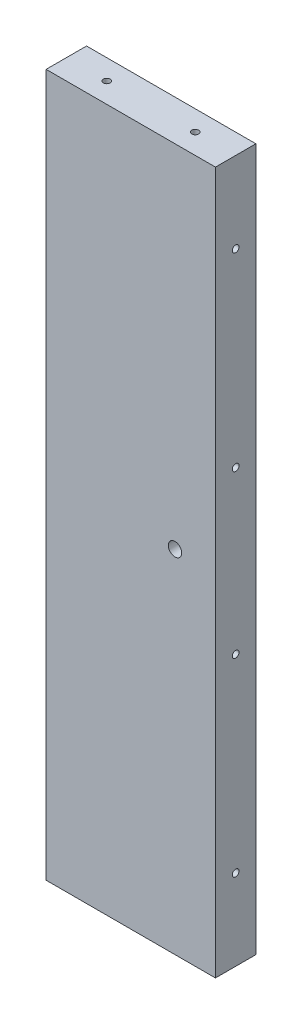
ISO-10303-21;
HEADER;
FILE_DESCRIPTION(('STEP AP214'),'2;1');
FILE_NAME('part.step','',(''),(''),'','','');
FILE_SCHEMA(('AUTOMOTIVE_DESIGN { 1 0 10303 214 1 1 1 1 }'));
ENDSEC;
DATA;
#1=APPLICATION_CONTEXT('core data for automotive mechanical design processes');
#2=APPLICATION_PROTOCOL_DEFINITION('international standard','automotive_design',2000,#1);
#3=PRODUCT_CONTEXT('',#1,'mechanical');
#4=PRODUCT('Part','Part','',(#3));
#5=PRODUCT_RELATED_PRODUCT_CATEGORY('part','',(#4));
#6=PRODUCT_DEFINITION_FORMATION('','',#4);
#7=PRODUCT_DEFINITION_CONTEXT('part definition',#1,'design');
#8=PRODUCT_DEFINITION('design','',#6,#7);
#9=PRODUCT_DEFINITION_SHAPE('','',#8);
#10=(LENGTH_UNIT() NAMED_UNIT(*) SI_UNIT(.MILLI.,.METRE.));
#11=(NAMED_UNIT(*) PLANE_ANGLE_UNIT() SI_UNIT($,.RADIAN.));
#12=(NAMED_UNIT(*) SI_UNIT($,.STERADIAN.) SOLID_ANGLE_UNIT());
#13=UNCERTAINTY_MEASURE_WITH_UNIT(LENGTH_MEASURE(1.E-05),#10,'distance_accuracy_value','');
#14=(GEOMETRIC_REPRESENTATION_CONTEXT(3) GLOBAL_UNCERTAINTY_ASSIGNED_CONTEXT((#13)) GLOBAL_UNIT_ASSIGNED_CONTEXT((#10,
#11,#12)) REPRESENTATION_CONTEXT('',''));
#15=CARTESIAN_POINT('',(0.,0.,0.));
#16=DIRECTION('',(0.,0.,1.));
#17=DIRECTION('',(1.,0.,0.));
#18=AXIS2_PLACEMENT_3D('',#15,#16,#17);
#19=CARTESIAN_POINT('',(209.352967180645,93.4499999969934,19.05));
#20=DIRECTION('',(1.,0.,0.));
#21=DIRECTION('',(0.,1.,0.));
#22=AXIS2_PLACEMENT_3D('',#19,#20,#21);
#23=PLANE('',#22);
#24=DIRECTION('',(0.,-1.,0.));
#25=VECTOR('',#24,1.);
#26=CARTESIAN_POINT('',(209.352967180645,93.4499999969934,0.));
#27=LINE('',#26,#25);
#28=CARTESIAN_POINT('',(209.352967180645,93.4499999969934,0.));
#29=VERTEX_POINT('',#28);
#30=CARTESIAN_POINT('',(209.352967180645,-237.499999991006,0.));
#31=VERTEX_POINT('',#30);
#32=EDGE_CURVE('E141',#29,#31,#27,.T.);
#33=ORIENTED_EDGE('',*,*,#32,.T.);
#34=DIRECTION('',(0.,0.,-1.));
#35=VECTOR('',#34,1.);
#36=CARTESIAN_POINT('',(209.352967180645,-237.499999991006,19.05));
#37=LINE('',#36,#35);
#38=CARTESIAN_POINT('',(209.352967180645,-237.499999991006,19.05));
#39=VERTEX_POINT('',#38);
#40=EDGE_CURVE('E11',#39,#31,#37,.T.);
#41=ORIENTED_EDGE('',*,*,#40,.F.);
#42=DIRECTION('',(0.,-1.,0.));
#43=VECTOR('',#42,1.);
#44=CARTESIAN_POINT('',(209.352967180645,93.4499999969934,19.05));
#45=LINE('',#44,#43);
#46=CARTESIAN_POINT('',(209.352967180645,93.4499999969934,19.05));
#47=VERTEX_POINT('',#46);
#48=EDGE_CURVE('E142',#47,#39,#45,.T.);
#49=ORIENTED_EDGE('',*,*,#48,.F.);
#50=DIRECTION('',(0.,0.,-1.));
#51=VECTOR('',#50,1.);
#52=CARTESIAN_POINT('',(209.352967180645,93.4499999969934,19.05));
#53=LINE('',#52,#51);
#54=EDGE_CURVE('E148',#47,#29,#53,.T.);
#55=ORIENTED_EDGE('',*,*,#54,.T.);
#56=EDGE_LOOP('',(#33,#41,#49,#55));
#57=FACE_BOUND('',#56,.T.);
#58=ADVANCED_FACE('F35',(#57),#23,.F.);
#59=CARTESIAN_POINT('',(209.352967180645,-237.499999991006,19.05));
#60=DIRECTION('',(0.,1.,0.));
#61=DIRECTION('',(0.,0.,1.));
#62=AXIS2_PLACEMENT_3D('',#59,#60,#61);
#63=PLANE('',#62);
#64=DIRECTION('',(1.,0.,0.));
#65=VECTOR('',#64,1.);
#66=CARTESIAN_POINT('',(209.352967180645,-237.499999991006,0.));
#67=LINE('',#66,#65);
#68=CARTESIAN_POINT('',(289.146618108645,-237.499999991006,0.));
#69=VERTEX_POINT('',#68);
#70=EDGE_CURVE('E151',#31,#69,#67,.T.);
#71=ORIENTED_EDGE('',*,*,#70,.T.);
#72=DIRECTION('',(0.,0.,-1.));
#73=VECTOR('',#72,1.);
#74=CARTESIAN_POINT('',(289.146618108645,-237.499999991006,19.05));
#75=LINE('',#74,#73);
#76=CARTESIAN_POINT('',(289.146618108645,-237.499999991006,19.05));
#77=VERTEX_POINT('',#76);
#78=EDGE_CURVE('E44',#77,#69,#75,.T.);
#79=ORIENTED_EDGE('',*,*,#78,.F.);
#80=DIRECTION('',(1.,0.,0.));
#81=VECTOR('',#80,1.);
#82=CARTESIAN_POINT('',(209.352967180645,-237.499999991006,19.05));
#83=LINE('',#82,#81);
#84=EDGE_CURVE('E84',#39,#77,#83,.T.);
#85=ORIENTED_EDGE('',*,*,#84,.F.);
#86=ORIENTED_EDGE('',*,*,#40,.T.);
#87=EDGE_LOOP('',(#71,#79,#85,#86));
#88=FACE_BOUND('',#87,.T.);
#89=ADVANCED_FACE('F188',(#88),#63,.F.);
#90=CARTESIAN_POINT('',(289.146618108645,93.4499999969934,19.05));
#91=DIRECTION('',(-1.,0.,0.));
#92=DIRECTION('',(0.,-1.,0.));
#93=AXIS2_PLACEMENT_3D('',#90,#91,#92);
#94=PLANE('',#93);
#95=CARTESIAN_POINT('',(289.146618108645,55.3499999971998,9.52499989602375));
#96=DIRECTION('',(-1.,0.,0.));
#97=DIRECTION('',(0.,-1.,0.));
#98=AXIS2_PLACEMENT_3D('',#95,#96,#97);
#99=CIRCLE('',#98,1.5875);
#100=CARTESIAN_POINT('',(289.146618108645,53.7624999971998,9.52499989602375));
#101=VERTEX_POINT('',#100);
#102=EDGE_CURVE('E122',#101,#101,#99,.T.);
#103=ORIENTED_EDGE('',*,*,#102,.T.);
#104=EDGE_LOOP('',(#103));
#105=FACE_BOUND('',#104,.T.);
#106=CARTESIAN_POINT('',(289.146618108645,-33.9249999969054,9.52499989602175));
#107=DIRECTION('',(-1.,0.,0.));
#108=DIRECTION('',(0.,-1.,0.));
#109=AXIS2_PLACEMENT_3D('',#106,#107,#108);
#110=CIRCLE('',#109,1.5875);
#111=CARTESIAN_POINT('',(289.146618108645,-35.5124999969054,9.52499989602175));
#112=VERTEX_POINT('',#111);
#113=EDGE_CURVE('E126',#112,#112,#110,.T.);
#114=ORIENTED_EDGE('',*,*,#113,.T.);
#115=EDGE_LOOP('',(#114));
#116=FACE_BOUND('',#115,.T.);
#117=CARTESIAN_POINT('',(289.146618108645,-110.124999996905,9.52499989602175));
#118=DIRECTION('',(-1.,0.,0.));
#119=DIRECTION('',(0.,-1.,0.));
#120=AXIS2_PLACEMENT_3D('',#117,#118,#119);
#121=CIRCLE('',#120,1.58750000000001);
#122=CARTESIAN_POINT('',(289.146618108645,-111.712499996905,9.52499989602175));
#123=VERTEX_POINT('',#122);
#124=EDGE_CURVE('E130',#123,#123,#121,.T.);
#125=ORIENTED_EDGE('',*,*,#124,.T.);
#126=EDGE_LOOP('',(#125));
#127=FACE_BOUND('',#126,.T.);
#128=CARTESIAN_POINT('',(289.146618108645,-199.399999991011,9.52499989602375));
#129=DIRECTION('',(-1.,0.,0.));
#130=DIRECTION('',(0.,-1.,0.));
#131=AXIS2_PLACEMENT_3D('',#128,#129,#130);
#132=CIRCLE('',#131,1.58749999999999);
#133=CARTESIAN_POINT('',(289.146618108645,-200.987499991011,9.52499989602375));
#134=VERTEX_POINT('',#133);
#135=EDGE_CURVE('E134',#134,#134,#132,.T.);
#136=ORIENTED_EDGE('',*,*,#135,.T.);
#137=EDGE_LOOP('',(#136));
#138=FACE_BOUND('',#137,.T.);
#139=DIRECTION('',(0.,1.,0.));
#140=VECTOR('',#139,1.);
#141=CARTESIAN_POINT('',(289.146618108645,93.4499999969934,0.));
#142=LINE('',#141,#140);
#143=CARTESIAN_POINT('',(289.146618108645,93.4499999969934,0.));
#144=VERTEX_POINT('',#143);
#145=EDGE_CURVE('E71',#69,#144,#142,.T.);
#146=ORIENTED_EDGE('',*,*,#145,.T.);
#147=DIRECTION('',(0.,0.,-1.));
#148=VECTOR('',#147,1.);
#149=CARTESIAN_POINT('',(289.146618108645,93.4499999969934,19.05));
#150=LINE('',#149,#148);
#151=CARTESIAN_POINT('',(289.146618108645,93.4499999969934,19.05));
#152=VERTEX_POINT('',#151);
#153=EDGE_CURVE('E156',#152,#144,#150,.T.);
#154=ORIENTED_EDGE('',*,*,#153,.F.);
#155=DIRECTION('',(0.,1.,0.));
#156=VECTOR('',#155,1.);
#157=CARTESIAN_POINT('',(289.146618108645,93.4499999969934,19.05));
#158=LINE('',#157,#156);
#159=EDGE_CURVE('E145',#77,#152,#158,.T.);
#160=ORIENTED_EDGE('',*,*,#159,.F.);
#161=ORIENTED_EDGE('',*,*,#78,.T.);
#162=EDGE_LOOP('',(#146,#154,#160,#161));
#163=FACE_BOUND('',#162,.T.);
#164=ADVANCED_FACE('F193',(#105,#116,#127,#138,#163),#94,.F.);
#165=CARTESIAN_POINT('',(209.352967180645,93.4499999969934,19.05));
#166=DIRECTION('',(0.,-1.,0.));
#167=DIRECTION('',(0.,0.,-1.));
#168=AXIS2_PLACEMENT_3D('',#165,#166,#167);
#169=PLANE('',#168);
#170=CARTESIAN_POINT('',(228.402967180674,93.4499999969934,9.52499999998606));
#171=DIRECTION('',(0.,-1.,0.));
#172=DIRECTION('',(0.,0.,-1.));
#173=AXIS2_PLACEMENT_3D('',#170,#171,#172);
#174=CIRCLE('',#173,1.58749999999999);
#175=CARTESIAN_POINT('',(228.402967180674,93.4499999969934,7.93749999998607));
#176=VERTEX_POINT('',#175);
#177=EDGE_CURVE('E38',#176,#176,#174,.T.);
#178=ORIENTED_EDGE('',*,*,#177,.T.);
#179=EDGE_LOOP('',(#178));
#180=FACE_BOUND('',#179,.T.);
#181=CARTESIAN_POINT('',(270.096618108674,93.4499999969934,9.5249999999854));
#182=DIRECTION('',(0.,-1.,0.));
#183=DIRECTION('',(0.,0.,-1.));
#184=AXIS2_PLACEMENT_3D('',#181,#182,#183);
#185=CIRCLE('',#184,1.58750000000002);
#186=CARTESIAN_POINT('',(270.096618108674,93.4499999969934,7.93749999998538));
#187=VERTEX_POINT('',#186);
#188=EDGE_CURVE('E118',#187,#187,#185,.T.);
#189=ORIENTED_EDGE('',*,*,#188,.T.);
#190=EDGE_LOOP('',(#189));
#191=FACE_BOUND('',#190,.T.);
#192=DIRECTION('',(-1.,0.,0.));
#193=VECTOR('',#192,1.);
#194=CARTESIAN_POINT('',(209.352967180645,93.4499999969934,0.));
#195=LINE('',#194,#193);
#196=EDGE_CURVE('E77',#144,#29,#195,.T.);
#197=ORIENTED_EDGE('',*,*,#196,.T.);
#198=ORIENTED_EDGE('',*,*,#54,.F.);
#199=DIRECTION('',(-1.,0.,0.));
#200=VECTOR('',#199,1.);
#201=CARTESIAN_POINT('',(209.352967180645,93.4499999969934,19.05));
#202=LINE('',#201,#200);
#203=EDGE_CURVE('E53',#152,#47,#202,.T.);
#204=ORIENTED_EDGE('',*,*,#203,.F.);
#205=ORIENTED_EDGE('',*,*,#153,.T.);
#206=EDGE_LOOP('',(#197,#198,#204,#205));
#207=FACE_BOUND('',#206,.T.);
#208=ADVANCED_FACE('F169',(#180,#191,#207),#169,.F.);
#209=CARTESIAN_POINT('',(0.,0.,19.05));
#210=DIRECTION('',(0.,0.,1.));
#211=DIRECTION('',(1.,0.,0.));
#212=AXIS2_PLACEMENT_3D('',#209,#210,#211);
#213=PLANE('',#212);
#214=CARTESIAN_POINT('',(270.096618017201,-72.0249999971125,19.05));
#215=DIRECTION('',(0.,0.,-1.));
#216=DIRECTION('',(-1.,0.,0.));
#217=AXIS2_PLACEMENT_3D('',#214,#215,#216);
#218=CIRCLE('',#217,3.17499999999993);
#219=CARTESIAN_POINT('',(266.921618017201,-72.0249999971125,19.05));
#220=VERTEX_POINT('',#219);
#221=EDGE_CURVE('E138',#220,#220,#218,.T.);
#222=ORIENTED_EDGE('',*,*,#221,.T.);
#223=EDGE_LOOP('',(#222));
#224=FACE_BOUND('',#223,.T.);
#225=ORIENTED_EDGE('',*,*,#48,.T.);
#226=ORIENTED_EDGE('',*,*,#84,.T.);
#227=ORIENTED_EDGE('',*,*,#159,.T.);
#228=ORIENTED_EDGE('',*,*,#203,.T.);
#229=EDGE_LOOP('',(#225,#226,#227,#228));
#230=FACE_BOUND('',#229,.T.);
#231=ADVANCED_FACE('F200',(#224,#230),#213,.T.);
#232=CARTESIAN_POINT('',(0.,0.,0.));
#233=DIRECTION('',(0.,0.,1.));
#234=DIRECTION('',(1.,0.,0.));
#235=AXIS2_PLACEMENT_3D('',#232,#233,#234);
#236=PLANE('',#235);
#237=CARTESIAN_POINT('',(270.096618017201,-72.0249999971125,0.));
#238=DIRECTION('',(0.,0.,-1.));
#239=DIRECTION('',(-1.,0.,0.));
#240=AXIS2_PLACEMENT_3D('',#237,#238,#239);
#241=CIRCLE('',#240,3.17499999999993);
#242=CARTESIAN_POINT('',(266.921618017201,-72.0249999971125,0.));
#243=VERTEX_POINT('',#242);
#244=EDGE_CURVE('E135',#243,#243,#241,.T.);
#245=ORIENTED_EDGE('',*,*,#244,.F.);
#246=EDGE_LOOP('',(#245));
#247=FACE_BOUND('',#246,.T.);
#248=ORIENTED_EDGE('',*,*,#32,.F.);
#249=ORIENTED_EDGE('',*,*,#196,.F.);
#250=ORIENTED_EDGE('',*,*,#145,.F.);
#251=ORIENTED_EDGE('',*,*,#70,.F.);
#252=EDGE_LOOP('',(#248,#249,#250,#251));
#253=FACE_BOUND('',#252,.T.);
#254=ADVANCED_FACE('F198',(#247,#253),#236,.F.);
#255=CARTESIAN_POINT('',(270.096618017201,-72.0249999971125,0.));
#256=DIRECTION('',(0.,0.,-1.));
#257=DIRECTION('',(-1.,0.,0.));
#258=AXIS2_PLACEMENT_3D('',#255,#256,#257);
#259=CYLINDRICAL_SURFACE('',#258,3.17499999999993);
#260=ORIENTED_EDGE('',*,*,#221,.F.);
#261=EDGE_LOOP('',(#260));
#262=FACE_BOUND('',#261,.T.);
#263=ORIENTED_EDGE('',*,*,#244,.T.);
#264=EDGE_LOOP('',(#263));
#265=FACE_BOUND('',#264,.T.);
#266=ADVANCED_FACE('F208',(#262,#265),#259,.F.);
#267=CARTESIAN_POINT('',(308.196618108645,-199.399999991011,9.52499989602373));
#268=DIRECTION('',(1.,0.,0.));
#269=DIRECTION('',(0.,0.,-1.));
#270=AXIS2_PLACEMENT_3D('',#267,#268,#269);
#271=CYLINDRICAL_SURFACE('',#270,1.58749999999999);
#272=CARTESIAN_POINT('',(270.096618108645,-199.399999991011,9.52499989602376));
#273=DIRECTION('',(1.,0.,0.));
#274=DIRECTION('',(0.,0.,-1.));
#275=AXIS2_PLACEMENT_3D('',#272,#273,#274);
#276=CIRCLE('',#275,1.58749999999999);
#277=CARTESIAN_POINT('',(270.096618108645,-199.399999991011,7.93749989602377));
#278=VERTEX_POINT('',#277);
#279=EDGE_CURVE('E131',#278,#278,#276,.T.);
#280=ORIENTED_EDGE('',*,*,#279,.F.);
#281=EDGE_LOOP('',(#280));
#282=FACE_BOUND('',#281,.T.);
#283=ORIENTED_EDGE('',*,*,#135,.F.);
#284=EDGE_LOOP('',(#283));
#285=FACE_BOUND('',#284,.T.);
#286=ADVANCED_FACE('F228',(#282,#285),#271,.F.);
#287=CARTESIAN_POINT('',(270.096618108645,-199.399999991011,9.52499989602376));
#288=DIRECTION('',(1.,0.,0.));
#289=DIRECTION('',(0.,0.,-1.));
#290=AXIS2_PLACEMENT_3D('',#287,#288,#289);
#291=CONICAL_SURFACE('',#290,1.58749999999999,1.02974425867667);
#292=CARTESIAN_POINT('',(269.142751875939,-199.399999991011,9.52499989602376));
#293=VERTEX_POINT('',#292);
#294=VERTEX_LOOP('',#293);
#295=FACE_BOUND('',#294,.T.);
#296=ORIENTED_EDGE('',*,*,#279,.T.);
#297=EDGE_LOOP('',(#296));
#298=FACE_BOUND('',#297,.T.);
#299=ADVANCED_FACE('F230',(#295,#298),#291,.F.);
#300=CARTESIAN_POINT('',(308.196618108645,-110.124999996905,9.52499989602174));
#301=DIRECTION('',(1.,0.,0.));
#302=DIRECTION('',(0.,0.,-1.));
#303=AXIS2_PLACEMENT_3D('',#300,#301,#302);
#304=CYLINDRICAL_SURFACE('',#303,1.58750000000001);
#305=CARTESIAN_POINT('',(270.096618108645,-110.124999996905,9.52499989602176));
#306=DIRECTION('',(1.,0.,0.));
#307=DIRECTION('',(0.,0.,-1.));
#308=AXIS2_PLACEMENT_3D('',#305,#306,#307);
#309=CIRCLE('',#308,1.58750000000001);
#310=CARTESIAN_POINT('',(270.096618108645,-110.124999996905,7.93749989602176));
#311=VERTEX_POINT('',#310);
#312=EDGE_CURVE('E127',#311,#311,#309,.T.);
#313=ORIENTED_EDGE('',*,*,#312,.F.);
#314=EDGE_LOOP('',(#313));
#315=FACE_BOUND('',#314,.T.);
#316=ORIENTED_EDGE('',*,*,#124,.F.);
#317=EDGE_LOOP('',(#316));
#318=FACE_BOUND('',#317,.T.);
#319=ADVANCED_FACE('F237',(#315,#318),#304,.F.);
#320=CARTESIAN_POINT('',(270.096618108645,-110.124999996905,9.52499989602176));
#321=DIRECTION('',(1.,0.,0.));
#322=DIRECTION('',(0.,0.,-1.));
#323=AXIS2_PLACEMENT_3D('',#320,#321,#322);
#324=CONICAL_SURFACE('',#323,1.58750000000001,1.02974425867667);
#325=CARTESIAN_POINT('',(269.142751875939,-110.124999996905,9.52499989602176));
#326=VERTEX_POINT('',#325);
#327=VERTEX_LOOP('',#326);
#328=FACE_BOUND('',#327,.T.);
#329=ORIENTED_EDGE('',*,*,#312,.T.);
#330=EDGE_LOOP('',(#329));
#331=FACE_BOUND('',#330,.T.);
#332=ADVANCED_FACE('F242',(#328,#331),#324,.F.);
#333=CARTESIAN_POINT('',(308.196618108646,-33.9249999969054,9.52499989602174));
#334=DIRECTION('',(1.,0.,0.));
#335=DIRECTION('',(0.,0.,-1.));
#336=AXIS2_PLACEMENT_3D('',#333,#334,#335);
#337=CYLINDRICAL_SURFACE('',#336,1.5875);
#338=CARTESIAN_POINT('',(270.096618108646,-33.9249999969054,9.52499989602176));
#339=DIRECTION('',(1.,0.,0.));
#340=DIRECTION('',(0.,0.,-1.));
#341=AXIS2_PLACEMENT_3D('',#338,#339,#340);
#342=CIRCLE('',#341,1.5875);
#343=CARTESIAN_POINT('',(270.096618108646,-33.9249999969054,7.93749989602176));
#344=VERTEX_POINT('',#343);
#345=EDGE_CURVE('E123',#344,#344,#342,.T.);
#346=ORIENTED_EDGE('',*,*,#345,.F.);
#347=EDGE_LOOP('',(#346));
#348=FACE_BOUND('',#347,.T.);
#349=ORIENTED_EDGE('',*,*,#113,.F.);
#350=EDGE_LOOP('',(#349));
#351=FACE_BOUND('',#350,.T.);
#352=ADVANCED_FACE('F245',(#348,#351),#337,.F.);
#353=CARTESIAN_POINT('',(270.096618108646,-33.9249999969054,9.52499989602176));
#354=DIRECTION('',(1.,0.,0.));
#355=DIRECTION('',(0.,0.,-1.));
#356=AXIS2_PLACEMENT_3D('',#353,#354,#355);
#357=CONICAL_SURFACE('',#356,1.5875,1.02974425867667);
#358=CARTESIAN_POINT('',(269.14275187594,-33.9249999969054,9.52499989602176));
#359=VERTEX_POINT('',#358);
#360=VERTEX_LOOP('',#359);
#361=FACE_BOUND('',#360,.T.);
#362=ORIENTED_EDGE('',*,*,#345,.T.);
#363=EDGE_LOOP('',(#362));
#364=FACE_BOUND('',#363,.T.);
#365=ADVANCED_FACE('F250',(#361,#364),#357,.F.);
#366=CARTESIAN_POINT('',(308.196618108647,55.3499999971998,9.52499989602373));
#367=DIRECTION('',(1.,0.,0.));
#368=DIRECTION('',(0.,0.,-1.));
#369=AXIS2_PLACEMENT_3D('',#366,#367,#368);
#370=CYLINDRICAL_SURFACE('',#369,1.5875);
#371=CARTESIAN_POINT('',(270.096618108647,55.3499999971998,9.52499989602376));
#372=DIRECTION('',(1.,0.,0.));
#373=DIRECTION('',(0.,0.,-1.));
#374=AXIS2_PLACEMENT_3D('',#371,#372,#373);
#375=CIRCLE('',#374,1.5875);
#376=CARTESIAN_POINT('',(270.096618108647,55.3499999971998,7.93749989602376));
#377=VERTEX_POINT('',#376);
#378=EDGE_CURVE('E119',#377,#377,#375,.T.);
#379=ORIENTED_EDGE('',*,*,#378,.F.);
#380=EDGE_LOOP('',(#379));
#381=FACE_BOUND('',#380,.T.);
#382=ORIENTED_EDGE('',*,*,#102,.F.);
#383=EDGE_LOOP('',(#382));
#384=FACE_BOUND('',#383,.T.);
#385=ADVANCED_FACE('F183',(#381,#384),#370,.F.);
#386=CARTESIAN_POINT('',(270.096618108647,55.3499999971998,9.52499989602376));
#387=DIRECTION('',(1.,0.,0.));
#388=DIRECTION('',(0.,0.,-1.));
#389=AXIS2_PLACEMENT_3D('',#386,#387,#388);
#390=CONICAL_SURFACE('',#389,1.5875,1.02974425867667);
#391=CARTESIAN_POINT('',(269.14275187594,55.3499999971998,9.52499989602376));
#392=VERTEX_POINT('',#391);
#393=VERTEX_LOOP('',#392);
#394=FACE_BOUND('',#393,.T.);
#395=ORIENTED_EDGE('',*,*,#378,.T.);
#396=EDGE_LOOP('',(#395));
#397=FACE_BOUND('',#396,.T.);
#398=ADVANCED_FACE('F174',(#394,#397),#390,.F.);
#399=CARTESIAN_POINT('',(270.096618108674,112.499999996996,9.52499999998535));
#400=DIRECTION('',(0.,1.,0.));
#401=DIRECTION('',(0.,0.,1.));
#402=AXIS2_PLACEMENT_3D('',#399,#400,#401);
#403=CYLINDRICAL_SURFACE('',#402,1.58750000000002);
#404=CARTESIAN_POINT('',(270.096618108674,72.8138662297019,9.52499999998545));
#405=DIRECTION('',(0.,1.,0.));
#406=DIRECTION('',(0.,0.,1.));
#407=AXIS2_PLACEMENT_3D('',#404,#405,#406);
#408=CIRCLE('',#407,1.58750000000002);
#409=CARTESIAN_POINT('',(270.096618108674,72.8138662297019,11.1124999999855));
#410=VERTEX_POINT('',#409);
#411=EDGE_CURVE('E114',#410,#410,#408,.T.);
#412=ORIENTED_EDGE('',*,*,#411,.F.);
#413=EDGE_LOOP('',(#412));
#414=FACE_BOUND('',#413,.T.);
#415=ORIENTED_EDGE('',*,*,#188,.F.);
#416=EDGE_LOOP('',(#415));
#417=FACE_BOUND('',#416,.T.);
#418=ADVANCED_FACE('F171',(#414,#417),#403,.F.);
#419=CARTESIAN_POINT('',(270.096618108674,72.8138662297019,9.52499999998545));
#420=DIRECTION('',(0.,1.,0.));
#421=DIRECTION('',(0.,0.,1.));
#422=AXIS2_PLACEMENT_3D('',#419,#420,#421);
#423=CONICAL_SURFACE('',#422,1.58750000000002,1.02974425867667);
#424=CARTESIAN_POINT('',(270.096618108674,71.8599999969956,9.52499999998545));
#425=VERTEX_POINT('',#424);
#426=VERTEX_LOOP('',#425);
#427=FACE_BOUND('',#426,.T.);
#428=ORIENTED_EDGE('',*,*,#411,.T.);
#429=EDGE_LOOP('',(#428));
#430=FACE_BOUND('',#429,.T.);
#431=ADVANCED_FACE('F173',(#427,#430),#423,.F.);
#432=CARTESIAN_POINT('',(228.402967180674,112.499999996996,9.52499999998602));
#433=DIRECTION('',(0.,1.,0.));
#434=DIRECTION('',(0.,0.,1.));
#435=AXIS2_PLACEMENT_3D('',#432,#433,#434);
#436=CYLINDRICAL_SURFACE('',#435,1.58749999999999);
#437=CARTESIAN_POINT('',(228.402967180674,72.8138662297019,9.52499999998611));
#438=DIRECTION('',(0.,1.,0.));
#439=DIRECTION('',(0.,0.,1.));
#440=AXIS2_PLACEMENT_3D('',#437,#438,#439);
#441=CIRCLE('',#440,1.58749999999999);
#442=CARTESIAN_POINT('',(228.402967180674,72.8138662297019,11.1124999999861));
#443=VERTEX_POINT('',#442);
#444=EDGE_CURVE('E110',#443,#443,#441,.T.);
#445=ORIENTED_EDGE('',*,*,#444,.F.);
#446=EDGE_LOOP('',(#445));
#447=FACE_BOUND('',#446,.T.);
#448=ORIENTED_EDGE('',*,*,#177,.F.);
#449=EDGE_LOOP('',(#448));
#450=FACE_BOUND('',#449,.T.);
#451=ADVANCED_FACE('F106',(#447,#450),#436,.F.);
#452=CARTESIAN_POINT('',(228.402967180674,72.8138662297019,9.52499999998611));
#453=DIRECTION('',(0.,1.,0.));
#454=DIRECTION('',(0.,0.,1.));
#455=AXIS2_PLACEMENT_3D('',#452,#453,#454);
#456=CONICAL_SURFACE('',#455,1.58749999999999,1.02974425867666);
#457=CARTESIAN_POINT('',(228.402967180674,71.8599999969957,9.52499999998612));
#458=VERTEX_POINT('',#457);
#459=VERTEX_LOOP('',#458);
#460=FACE_BOUND('',#459,.T.);
#461=ORIENTED_EDGE('',*,*,#444,.T.);
#462=EDGE_LOOP('',(#461));
#463=FACE_BOUND('',#462,.T.);
#464=ADVANCED_FACE('F103',(#460,#463),#456,.F.);
#465=CLOSED_SHELL('',(#58,#89,#164,#208,#231,#254,#266,#286,#299,#319,#332,#352,#365,#385,#398,
#418,#431,#451,#464));
#466=MANIFOLD_SOLID_BREP('B2',#465);
#467=ADVANCED_BREP_SHAPE_REPRESENTATION('',(#18,#466),#14);
#468=SHAPE_DEFINITION_REPRESENTATION(#9,#467);
ENDSEC;
END-ISO-10303-21;
